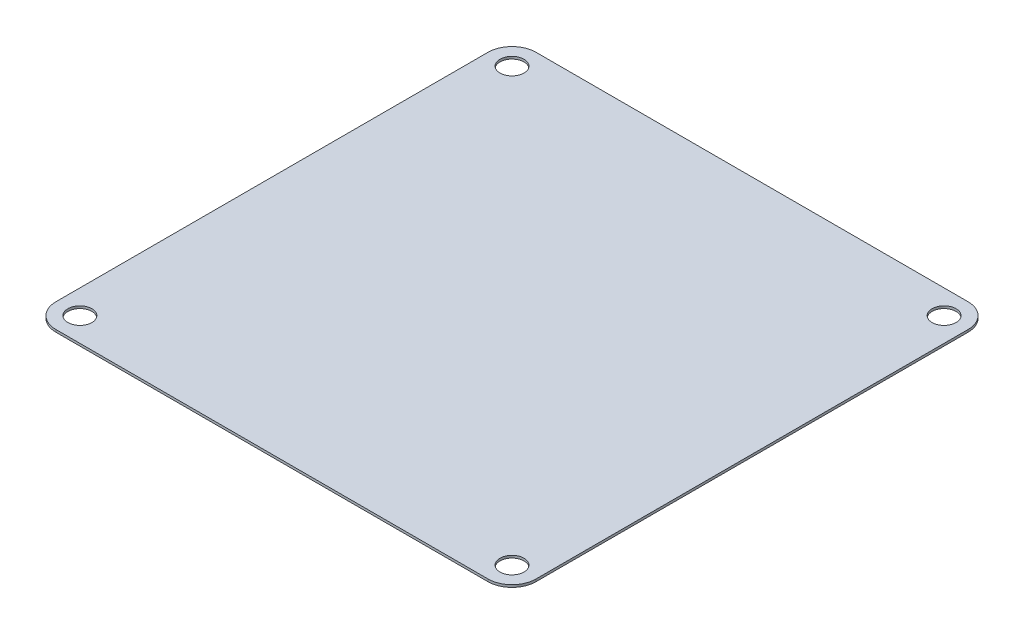
ISO-10303-21;
HEADER;
FILE_DESCRIPTION(('STEP AP214'),'2;1');
FILE_NAME('part.step','',(''),(''),'','','');
FILE_SCHEMA(('AUTOMOTIVE_DESIGN { 1 0 10303 214 1 1 1 1 }'));
ENDSEC;
DATA;
#1=APPLICATION_CONTEXT('core data for automotive mechanical design processes');
#2=APPLICATION_PROTOCOL_DEFINITION('international standard','automotive_design',2000,#1);
#3=PRODUCT_CONTEXT('',#1,'mechanical');
#4=PRODUCT('Part','Part','',(#3));
#5=PRODUCT_RELATED_PRODUCT_CATEGORY('part','',(#4));
#6=PRODUCT_DEFINITION_FORMATION('','',#4);
#7=PRODUCT_DEFINITION_CONTEXT('part definition',#1,'design');
#8=PRODUCT_DEFINITION('design','',#6,#7);
#9=PRODUCT_DEFINITION_SHAPE('','',#8);
#10=(LENGTH_UNIT() NAMED_UNIT(*) SI_UNIT(.MILLI.,.METRE.));
#11=(NAMED_UNIT(*) PLANE_ANGLE_UNIT() SI_UNIT($,.RADIAN.));
#12=(NAMED_UNIT(*) SI_UNIT($,.STERADIAN.) SOLID_ANGLE_UNIT());
#13=UNCERTAINTY_MEASURE_WITH_UNIT(LENGTH_MEASURE(1.E-05),#10,'distance_accuracy_value','');
#14=(GEOMETRIC_REPRESENTATION_CONTEXT(3) GLOBAL_UNCERTAINTY_ASSIGNED_CONTEXT((#13)) GLOBAL_UNIT_ASSIGNED_CONTEXT((#10,
#11,#12)) REPRESENTATION_CONTEXT('',''));
#15=CARTESIAN_POINT('',(0.,0.,0.));
#16=DIRECTION('',(0.,0.,1.));
#17=DIRECTION('',(1.,0.,0.));
#18=AXIS2_PLACEMENT_3D('',#15,#16,#17);
#19=CARTESIAN_POINT('',(-150.,1.,150.));
#20=DIRECTION('',(1.,0.,0.));
#21=DIRECTION('',(0.,0.,-1.));
#22=AXIS2_PLACEMENT_3D('',#19,#20,#21);
#23=PLANE('',#22);
#24=DIRECTION('',(0.,0.,1.));
#25=VECTOR('',#24,1.);
#26=CARTESIAN_POINT('',(-150.,0.,150.));
#27=LINE('',#26,#25);
#28=CARTESIAN_POINT('',(-150.,0.,-40.));
#29=VERTEX_POINT('',#28);
#30=CARTESIAN_POINT('',(-150.,0.,140.));
#31=VERTEX_POINT('',#30);
#32=EDGE_CURVE('E170',#29,#31,#27,.T.);
#33=ORIENTED_EDGE('',*,*,#32,.T.);
#34=DIRECTION('',(0.,-1.,0.));
#35=VECTOR('',#34,1.);
#36=CARTESIAN_POINT('',(-150.,1.,140.));
#37=LINE('',#36,#35);
#38=CARTESIAN_POINT('',(-150.,1.,140.));
#39=VERTEX_POINT('',#38);
#40=EDGE_CURVE('E11',#31,#39,#37,.F.);
#41=ORIENTED_EDGE('',*,*,#40,.T.);
#42=DIRECTION('',(0.,0.,1.));
#43=VECTOR('',#42,1.);
#44=CARTESIAN_POINT('',(-150.,1.,150.));
#45=LINE('',#44,#43);
#46=CARTESIAN_POINT('',(-150.,1.,-40.));
#47=VERTEX_POINT('',#46);
#48=EDGE_CURVE('E129',#47,#39,#45,.T.);
#49=ORIENTED_EDGE('',*,*,#48,.F.);
#50=DIRECTION('',(0.,-1.,0.));
#51=VECTOR('',#50,1.);
#52=CARTESIAN_POINT('',(-150.,1.,-40.));
#53=LINE('',#52,#51);
#54=EDGE_CURVE('E44',#47,#29,#53,.T.);
#55=ORIENTED_EDGE('',*,*,#54,.T.);
#56=EDGE_LOOP('',(#33,#41,#49,#55));
#57=FACE_BOUND('',#56,.T.);
#58=ADVANCED_FACE('F35',(#57),#23,.F.);
#59=CARTESIAN_POINT('',(50.,1.,150.));
#60=DIRECTION('',(0.,0.,-1.));
#61=DIRECTION('',(-1.,0.,0.));
#62=AXIS2_PLACEMENT_3D('',#59,#60,#61);
#63=PLANE('',#62);
#64=DIRECTION('',(1.,0.,0.));
#65=VECTOR('',#64,1.);
#66=CARTESIAN_POINT('',(50.,0.,150.));
#67=LINE('',#66,#65);
#68=CARTESIAN_POINT('',(-140.,0.,150.));
#69=VERTEX_POINT('',#68);
#70=CARTESIAN_POINT('',(40.,0.,150.));
#71=VERTEX_POINT('',#70);
#72=EDGE_CURVE('E134',#69,#71,#67,.T.);
#73=ORIENTED_EDGE('',*,*,#72,.T.);
#74=DIRECTION('',(0.,-1.,0.));
#75=VECTOR('',#74,1.);
#76=CARTESIAN_POINT('',(40.,1.,150.));
#77=LINE('',#76,#75);
#78=CARTESIAN_POINT('',(40.,1.,150.));
#79=VERTEX_POINT('',#78);
#80=EDGE_CURVE('E52',#71,#79,#77,.F.);
#81=ORIENTED_EDGE('',*,*,#80,.T.);
#82=DIRECTION('',(1.,0.,0.));
#83=VECTOR('',#82,1.);
#84=CARTESIAN_POINT('',(50.,1.,150.));
#85=LINE('',#84,#83);
#86=CARTESIAN_POINT('',(-140.,1.,150.));
#87=VERTEX_POINT('',#86);
#88=EDGE_CURVE('E132',#87,#79,#85,.T.);
#89=ORIENTED_EDGE('',*,*,#88,.F.);
#90=DIRECTION('',(0.,-1.,0.));
#91=VECTOR('',#90,1.);
#92=CARTESIAN_POINT('',(-140.,1.,150.));
#93=LINE('',#92,#91);
#94=EDGE_CURVE('E153',#87,#69,#93,.T.);
#95=ORIENTED_EDGE('',*,*,#94,.T.);
#96=EDGE_LOOP('',(#73,#81,#89,#95));
#97=FACE_BOUND('',#96,.T.);
#98=ADVANCED_FACE('F212',(#97),#63,.F.);
#99=CARTESIAN_POINT('',(50.,1.,150.));
#100=DIRECTION('',(-1.,0.,0.));
#101=DIRECTION('',(0.,0.,1.));
#102=AXIS2_PLACEMENT_3D('',#99,#100,#101);
#103=PLANE('',#102);
#104=DIRECTION('',(0.,0.,-1.));
#105=VECTOR('',#104,1.);
#106=CARTESIAN_POINT('',(50.,0.,150.));
#107=LINE('',#106,#105);
#108=CARTESIAN_POINT('',(50.,0.,140.));
#109=VERTEX_POINT('',#108);
#110=CARTESIAN_POINT('',(50.,0.,-40.));
#111=VERTEX_POINT('',#110);
#112=EDGE_CURVE('E130',#109,#111,#107,.T.);
#113=ORIENTED_EDGE('',*,*,#112,.T.);
#114=DIRECTION('',(0.,-1.,0.));
#115=VECTOR('',#114,1.);
#116=CARTESIAN_POINT('',(50.,1.,-40.));
#117=LINE('',#116,#115);
#118=CARTESIAN_POINT('',(50.,1.,-40.));
#119=VERTEX_POINT('',#118);
#120=EDGE_CURVE('E108',#111,#119,#117,.F.);
#121=ORIENTED_EDGE('',*,*,#120,.T.);
#122=DIRECTION('',(0.,0.,-1.));
#123=VECTOR('',#122,1.);
#124=CARTESIAN_POINT('',(50.,1.,150.));
#125=LINE('',#124,#123);
#126=CARTESIAN_POINT('',(50.,1.,140.));
#127=VERTEX_POINT('',#126);
#128=EDGE_CURVE('E179',#127,#119,#125,.T.);
#129=ORIENTED_EDGE('',*,*,#128,.F.);
#130=DIRECTION('',(0.,-1.,0.));
#131=VECTOR('',#130,1.);
#132=CARTESIAN_POINT('',(50.,1.,140.));
#133=LINE('',#132,#131);
#134=EDGE_CURVE('E113',#127,#109,#133,.T.);
#135=ORIENTED_EDGE('',*,*,#134,.T.);
#136=EDGE_LOOP('',(#113,#121,#129,#135));
#137=FACE_BOUND('',#136,.T.);
#138=ADVANCED_FACE('F208',(#137),#103,.F.);
#139=CARTESIAN_POINT('',(50.,1.,-50.));
#140=DIRECTION('',(0.,0.,1.));
#141=DIRECTION('',(1.,0.,0.));
#142=AXIS2_PLACEMENT_3D('',#139,#140,#141);
#143=PLANE('',#142);
#144=DIRECTION('',(-1.,0.,0.));
#145=VECTOR('',#144,1.);
#146=CARTESIAN_POINT('',(50.,1.,-50.));
#147=LINE('',#146,#145);
#148=CARTESIAN_POINT('',(40.,1.,-50.));
#149=VERTEX_POINT('',#148);
#150=CARTESIAN_POINT('',(-140.,1.,-50.));
#151=VERTEX_POINT('',#150);
#152=EDGE_CURVE('E123',#149,#151,#147,.T.);
#153=ORIENTED_EDGE('',*,*,#152,.F.);
#154=DIRECTION('',(0.,-1.,0.));
#155=VECTOR('',#154,1.);
#156=CARTESIAN_POINT('',(40.,1.,-50.));
#157=LINE('',#156,#155);
#158=CARTESIAN_POINT('',(40.,0.,-50.));
#159=VERTEX_POINT('',#158);
#160=EDGE_CURVE('E107',#149,#159,#157,.T.);
#161=ORIENTED_EDGE('',*,*,#160,.T.);
#162=DIRECTION('',(-1.,0.,0.));
#163=VECTOR('',#162,1.);
#164=CARTESIAN_POINT('',(50.,0.,-50.));
#165=LINE('',#164,#163);
#166=CARTESIAN_POINT('',(-140.,0.,-50.));
#167=VERTEX_POINT('',#166);
#168=EDGE_CURVE('E120',#159,#167,#165,.T.);
#169=ORIENTED_EDGE('',*,*,#168,.T.);
#170=DIRECTION('',(0.,-1.,0.));
#171=VECTOR('',#170,1.);
#172=CARTESIAN_POINT('',(-140.,1.,-50.));
#173=LINE('',#172,#171);
#174=EDGE_CURVE('E125',#167,#151,#173,.F.);
#175=ORIENTED_EDGE('',*,*,#174,.T.);
#176=EDGE_LOOP('',(#153,#161,#169,#175));
#177=FACE_BOUND('',#176,.T.);
#178=ADVANCED_FACE('F119',(#177),#143,.F.);
#179=CARTESIAN_POINT('',(0.,1.,0.));
#180=DIRECTION('',(0.,1.,0.));
#181=DIRECTION('',(0.,0.,1.));
#182=AXIS2_PLACEMENT_3D('',#179,#180,#181);
#183=PLANE('',#182);
#184=CARTESIAN_POINT('',(40.,1.,-40.));
#185=DIRECTION('',(0.,1.,0.));
#186=DIRECTION('',(0.,0.,1.));
#187=AXIS2_PLACEMENT_3D('',#184,#185,#186);
#188=CIRCLE('',#187,5.);
#189=CARTESIAN_POINT('',(40.,1.,-35.));
#190=VERTEX_POINT('',#189);
#191=EDGE_CURVE('E185',#190,#190,#188,.T.);
#192=ORIENTED_EDGE('',*,*,#191,.F.);
#193=EDGE_LOOP('',(#192));
#194=FACE_BOUND('',#193,.T.);
#195=CARTESIAN_POINT('',(-140.,1.,140.));
#196=DIRECTION('',(0.,1.,0.));
#197=DIRECTION('',(0.,0.,1.));
#198=AXIS2_PLACEMENT_3D('',#195,#196,#197);
#199=CIRCLE('',#198,5.00000000000002);
#200=CARTESIAN_POINT('',(-140.,1.,145.));
#201=VERTEX_POINT('',#200);
#202=EDGE_CURVE('E186',#201,#201,#199,.T.);
#203=ORIENTED_EDGE('',*,*,#202,.F.);
#204=EDGE_LOOP('',(#203));
#205=FACE_BOUND('',#204,.T.);
#206=CARTESIAN_POINT('',(40.,1.,140.));
#207=DIRECTION('',(0.,1.,0.));
#208=DIRECTION('',(0.,0.,1.));
#209=AXIS2_PLACEMENT_3D('',#206,#207,#208);
#210=CIRCLE('',#209,5.);
#211=CARTESIAN_POINT('',(40.,1.,145.));
#212=VERTEX_POINT('',#211);
#213=EDGE_CURVE('E189',#212,#212,#210,.T.);
#214=ORIENTED_EDGE('',*,*,#213,.F.);
#215=EDGE_LOOP('',(#214));
#216=FACE_BOUND('',#215,.T.);
#217=CARTESIAN_POINT('',(-140.,1.,-40.));
#218=DIRECTION('',(0.,1.,0.));
#219=DIRECTION('',(0.,0.,1.));
#220=AXIS2_PLACEMENT_3D('',#217,#218,#219);
#221=CIRCLE('',#220,5.00000000000002);
#222=CARTESIAN_POINT('',(-140.,1.,-35.));
#223=VERTEX_POINT('',#222);
#224=EDGE_CURVE('E163',#223,#223,#221,.T.);
#225=ORIENTED_EDGE('',*,*,#224,.F.);
#226=EDGE_LOOP('',(#225));
#227=FACE_BOUND('',#226,.T.);
#228=ORIENTED_EDGE('',*,*,#128,.T.);
#229=CARTESIAN_POINT('',(40.,1.,-40.));
#230=DIRECTION('',(0.,1.,0.));
#231=DIRECTION('',(0.,0.,1.));
#232=AXIS2_PLACEMENT_3D('',#229,#230,#231);
#233=CIRCLE('',#232,10.);
#234=EDGE_CURVE('E151',#119,#149,#233,.T.);
#235=ORIENTED_EDGE('',*,*,#234,.T.);
#236=ORIENTED_EDGE('',*,*,#152,.T.);
#237=CARTESIAN_POINT('',(-140.,1.,-40.));
#238=DIRECTION('',(0.,1.,0.));
#239=DIRECTION('',(0.,0.,1.));
#240=AXIS2_PLACEMENT_3D('',#237,#238,#239);
#241=CIRCLE('',#240,10.);
#242=EDGE_CURVE('E146',#151,#47,#241,.T.);
#243=ORIENTED_EDGE('',*,*,#242,.T.);
#244=ORIENTED_EDGE('',*,*,#48,.T.);
#245=CARTESIAN_POINT('',(-140.,1.,140.));
#246=DIRECTION('',(0.,1.,0.));
#247=DIRECTION('',(0.,0.,1.));
#248=AXIS2_PLACEMENT_3D('',#245,#246,#247);
#249=CIRCLE('',#248,10.);
#250=EDGE_CURVE('E59',#39,#87,#249,.T.);
#251=ORIENTED_EDGE('',*,*,#250,.T.);
#252=ORIENTED_EDGE('',*,*,#88,.T.);
#253=CARTESIAN_POINT('',(40.,1.,140.));
#254=DIRECTION('',(0.,1.,0.));
#255=DIRECTION('',(0.,0.,1.));
#256=AXIS2_PLACEMENT_3D('',#253,#254,#255);
#257=CIRCLE('',#256,10.);
#258=EDGE_CURVE('E149',#79,#127,#257,.T.);
#259=ORIENTED_EDGE('',*,*,#258,.T.);
#260=EDGE_LOOP('',(#228,#235,#236,#243,#244,#251,#252,#259));
#261=FACE_BOUND('',#260,.T.);
#262=ADVANCED_FACE('F198',(#194,#205,#216,#227,#261),#183,.T.);
#263=CARTESIAN_POINT('',(0.,0.,0.));
#264=DIRECTION('',(0.,1.,0.));
#265=DIRECTION('',(0.,0.,1.));
#266=AXIS2_PLACEMENT_3D('',#263,#264,#265);
#267=PLANE('',#266);
#268=CARTESIAN_POINT('',(40.,0.,-40.));
#269=DIRECTION('',(0.,1.,0.));
#270=DIRECTION('',(0.,0.,1.));
#271=AXIS2_PLACEMENT_3D('',#268,#269,#270);
#272=CIRCLE('',#271,5.);
#273=CARTESIAN_POINT('',(40.,0.,-35.));
#274=VERTEX_POINT('',#273);
#275=EDGE_CURVE('E39',#274,#274,#272,.T.);
#276=ORIENTED_EDGE('',*,*,#275,.T.);
#277=EDGE_LOOP('',(#276));
#278=FACE_BOUND('',#277,.T.);
#279=CARTESIAN_POINT('',(-140.,0.,140.));
#280=DIRECTION('',(0.,1.,0.));
#281=DIRECTION('',(0.,0.,1.));
#282=AXIS2_PLACEMENT_3D('',#279,#280,#281);
#283=CIRCLE('',#282,5.00000000000002);
#284=CARTESIAN_POINT('',(-140.,0.,145.));
#285=VERTEX_POINT('',#284);
#286=EDGE_CURVE('E165',#285,#285,#283,.T.);
#287=ORIENTED_EDGE('',*,*,#286,.T.);
#288=EDGE_LOOP('',(#287));
#289=FACE_BOUND('',#288,.T.);
#290=CARTESIAN_POINT('',(40.,0.,140.));
#291=DIRECTION('',(0.,1.,0.));
#292=DIRECTION('',(0.,0.,1.));
#293=AXIS2_PLACEMENT_3D('',#290,#291,#292);
#294=CIRCLE('',#293,5.);
#295=CARTESIAN_POINT('',(40.,0.,145.));
#296=VERTEX_POINT('',#295);
#297=EDGE_CURVE('E162',#296,#296,#294,.T.);
#298=ORIENTED_EDGE('',*,*,#297,.T.);
#299=EDGE_LOOP('',(#298));
#300=FACE_BOUND('',#299,.T.);
#301=CARTESIAN_POINT('',(-140.,0.,-40.));
#302=DIRECTION('',(0.,1.,0.));
#303=DIRECTION('',(0.,0.,1.));
#304=AXIS2_PLACEMENT_3D('',#301,#302,#303);
#305=CIRCLE('',#304,5.00000000000002);
#306=CARTESIAN_POINT('',(-140.,0.,-35.));
#307=VERTEX_POINT('',#306);
#308=EDGE_CURVE('E159',#307,#307,#305,.T.);
#309=ORIENTED_EDGE('',*,*,#308,.T.);
#310=EDGE_LOOP('',(#309));
#311=FACE_BOUND('',#310,.T.);
#312=ORIENTED_EDGE('',*,*,#168,.F.);
#313=CARTESIAN_POINT('',(40.,0.,-40.));
#314=DIRECTION('',(0.,1.,0.));
#315=DIRECTION('',(0.,0.,1.));
#316=AXIS2_PLACEMENT_3D('',#313,#314,#315);
#317=CIRCLE('',#316,10.);
#318=EDGE_CURVE('E103',#159,#111,#317,.F.);
#319=ORIENTED_EDGE('',*,*,#318,.T.);
#320=ORIENTED_EDGE('',*,*,#112,.F.);
#321=CARTESIAN_POINT('',(40.,0.,140.));
#322=DIRECTION('',(0.,1.,0.));
#323=DIRECTION('',(0.,0.,1.));
#324=AXIS2_PLACEMENT_3D('',#321,#322,#323);
#325=CIRCLE('',#324,10.);
#326=EDGE_CURVE('E114',#109,#71,#325,.F.);
#327=ORIENTED_EDGE('',*,*,#326,.T.);
#328=ORIENTED_EDGE('',*,*,#72,.F.);
#329=CARTESIAN_POINT('',(-140.,0.,140.));
#330=DIRECTION('',(0.,1.,0.));
#331=DIRECTION('',(0.,0.,1.));
#332=AXIS2_PLACEMENT_3D('',#329,#330,#331);
#333=CIRCLE('',#332,10.);
#334=EDGE_CURVE('E140',#69,#31,#333,.F.);
#335=ORIENTED_EDGE('',*,*,#334,.T.);
#336=ORIENTED_EDGE('',*,*,#32,.F.);
#337=CARTESIAN_POINT('',(-140.,0.,-40.));
#338=DIRECTION('',(0.,1.,0.));
#339=DIRECTION('',(0.,0.,1.));
#340=AXIS2_PLACEMENT_3D('',#337,#338,#339);
#341=CIRCLE('',#340,10.);
#342=EDGE_CURVE('E124',#29,#167,#341,.F.);
#343=ORIENTED_EDGE('',*,*,#342,.T.);
#344=EDGE_LOOP('',(#312,#319,#320,#327,#328,#335,#336,#343));
#345=FACE_BOUND('',#344,.T.);
#346=ADVANCED_FACE('F127',(#278,#289,#300,#311,#345),#267,.F.);
#347=CARTESIAN_POINT('',(40.,1.,-40.));
#348=DIRECTION('',(0.,-1.,0.));
#349=DIRECTION('',(0.,0.,-1.));
#350=AXIS2_PLACEMENT_3D('',#347,#348,#349);
#351=CYLINDRICAL_SURFACE('',#350,10.);
#352=ORIENTED_EDGE('',*,*,#234,.F.);
#353=ORIENTED_EDGE('',*,*,#120,.F.);
#354=ORIENTED_EDGE('',*,*,#318,.F.);
#355=ORIENTED_EDGE('',*,*,#160,.F.);
#356=EDGE_LOOP('',(#352,#353,#354,#355));
#357=FACE_BOUND('',#356,.T.);
#358=ADVANCED_FACE('F106',(#357),#351,.T.);
#359=CARTESIAN_POINT('',(40.,1.,140.));
#360=DIRECTION('',(0.,-1.,0.));
#361=DIRECTION('',(0.,0.,-1.));
#362=AXIS2_PLACEMENT_3D('',#359,#360,#361);
#363=CYLINDRICAL_SURFACE('',#362,10.);
#364=ORIENTED_EDGE('',*,*,#258,.F.);
#365=ORIENTED_EDGE('',*,*,#80,.F.);
#366=ORIENTED_EDGE('',*,*,#326,.F.);
#367=ORIENTED_EDGE('',*,*,#134,.F.);
#368=EDGE_LOOP('',(#364,#365,#366,#367));
#369=FACE_BOUND('',#368,.T.);
#370=ADVANCED_FACE('F210',(#369),#363,.T.);
#371=CARTESIAN_POINT('',(-140.,1.,140.));
#372=DIRECTION('',(0.,-1.,0.));
#373=DIRECTION('',(0.,0.,-1.));
#374=AXIS2_PLACEMENT_3D('',#371,#372,#373);
#375=CYLINDRICAL_SURFACE('',#374,10.);
#376=ORIENTED_EDGE('',*,*,#250,.F.);
#377=ORIENTED_EDGE('',*,*,#40,.F.);
#378=ORIENTED_EDGE('',*,*,#334,.F.);
#379=ORIENTED_EDGE('',*,*,#94,.F.);
#380=EDGE_LOOP('',(#376,#377,#378,#379));
#381=FACE_BOUND('',#380,.T.);
#382=ADVANCED_FACE('F215',(#381),#375,.T.);
#383=CARTESIAN_POINT('',(-140.,1.,-40.));
#384=DIRECTION('',(0.,-1.,0.));
#385=DIRECTION('',(0.,0.,-1.));
#386=AXIS2_PLACEMENT_3D('',#383,#384,#385);
#387=CYLINDRICAL_SURFACE('',#386,10.);
#388=ORIENTED_EDGE('',*,*,#242,.F.);
#389=ORIENTED_EDGE('',*,*,#174,.F.);
#390=ORIENTED_EDGE('',*,*,#342,.F.);
#391=ORIENTED_EDGE('',*,*,#54,.F.);
#392=EDGE_LOOP('',(#388,#389,#390,#391));
#393=FACE_BOUND('',#392,.T.);
#394=ADVANCED_FACE('F37',(#393),#387,.T.);
#395=CARTESIAN_POINT('',(-140.,-9.,-40.));
#396=DIRECTION('',(0.,1.,0.));
#397=DIRECTION('',(0.,0.,1.));
#398=AXIS2_PLACEMENT_3D('',#395,#396,#397);
#399=CYLINDRICAL_SURFACE('',#398,5.00000000000002);
#400=ORIENTED_EDGE('',*,*,#224,.T.);
#401=EDGE_LOOP('',(#400));
#402=FACE_BOUND('',#401,.T.);
#403=ORIENTED_EDGE('',*,*,#308,.F.);
#404=EDGE_LOOP('',(#403));
#405=FACE_BOUND('',#404,.T.);
#406=ADVANCED_FACE('F221',(#402,#405),#399,.F.);
#407=CARTESIAN_POINT('',(40.,-9.,140.));
#408=DIRECTION('',(0.,1.,0.));
#409=DIRECTION('',(0.,0.,1.));
#410=AXIS2_PLACEMENT_3D('',#407,#408,#409);
#411=CYLINDRICAL_SURFACE('',#410,5.);
#412=ORIENTED_EDGE('',*,*,#213,.T.);
#413=EDGE_LOOP('',(#412));
#414=FACE_BOUND('',#413,.T.);
#415=ORIENTED_EDGE('',*,*,#297,.F.);
#416=EDGE_LOOP('',(#415));
#417=FACE_BOUND('',#416,.T.);
#418=ADVANCED_FACE('F195',(#414,#417),#411,.F.);
#419=CARTESIAN_POINT('',(-140.,-9.,140.));
#420=DIRECTION('',(0.,1.,0.));
#421=DIRECTION('',(0.,0.,1.));
#422=AXIS2_PLACEMENT_3D('',#419,#420,#421);
#423=CYLINDRICAL_SURFACE('',#422,5.00000000000002);
#424=ORIENTED_EDGE('',*,*,#202,.T.);
#425=EDGE_LOOP('',(#424));
#426=FACE_BOUND('',#425,.T.);
#427=ORIENTED_EDGE('',*,*,#286,.F.);
#428=EDGE_LOOP('',(#427));
#429=FACE_BOUND('',#428,.T.);
#430=ADVANCED_FACE('F284',(#426,#429),#423,.F.);
#431=CARTESIAN_POINT('',(40.,-9.,-40.));
#432=DIRECTION('',(0.,1.,0.));
#433=DIRECTION('',(0.,0.,1.));
#434=AXIS2_PLACEMENT_3D('',#431,#432,#433);
#435=CYLINDRICAL_SURFACE('',#434,5.);
#436=ORIENTED_EDGE('',*,*,#191,.T.);
#437=EDGE_LOOP('',(#436));
#438=FACE_BOUND('',#437,.T.);
#439=ORIENTED_EDGE('',*,*,#275,.F.);
#440=EDGE_LOOP('',(#439));
#441=FACE_BOUND('',#440,.T.);
#442=ADVANCED_FACE('F293',(#438,#441),#435,.F.);
#443=CLOSED_SHELL('',(#58,#98,#138,#178,#262,#346,#358,#370,#382,#394,#406,#418,#430,#442));
#444=MANIFOLD_SOLID_BREP('B2',#443);
#445=ADVANCED_BREP_SHAPE_REPRESENTATION('',(#18,#444),#14);
#446=SHAPE_DEFINITION_REPRESENTATION(#9,#445);
ENDSEC;
END-ISO-10303-21;
